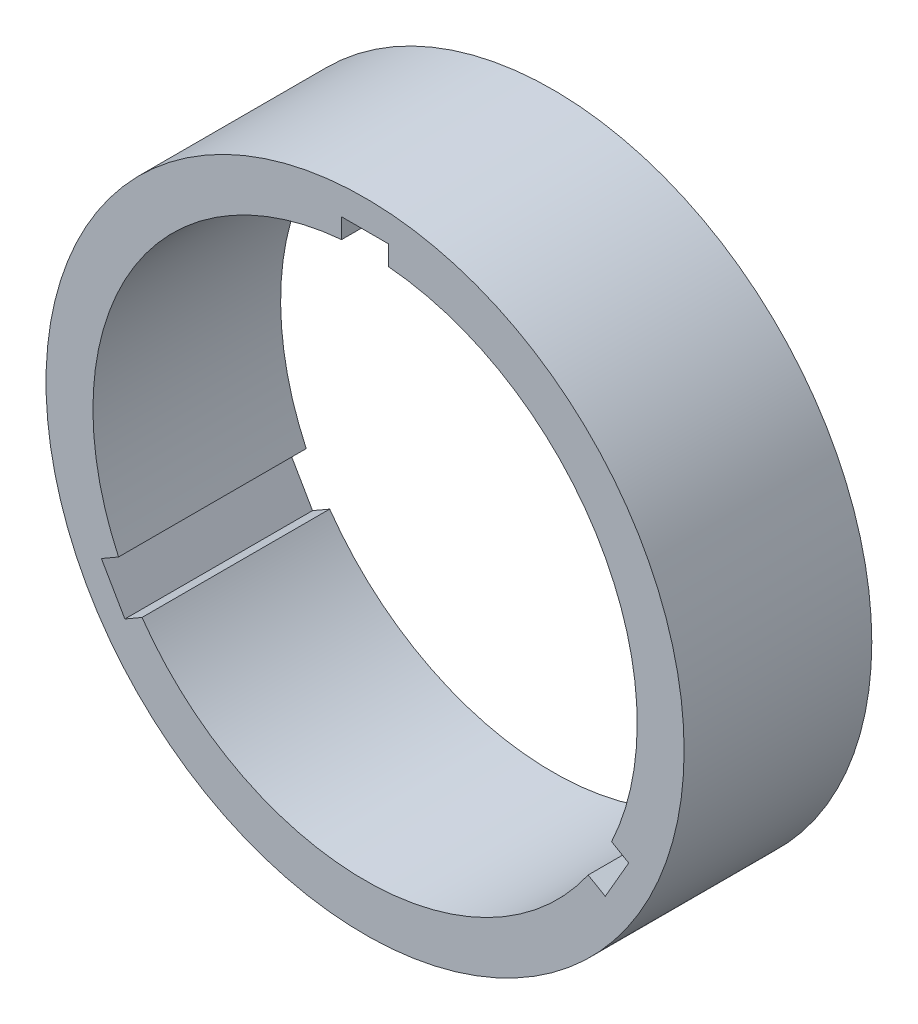
ISO-10303-21;
HEADER;
FILE_DESCRIPTION(('STEP AP214'),'2;1');
FILE_NAME('part.step','',(''),(''),'','','');
FILE_SCHEMA(('AUTOMOTIVE_DESIGN { 1 0 10303 214 1 1 1 1 }'));
ENDSEC;
DATA;
#1=APPLICATION_CONTEXT('core data for automotive mechanical design processes');
#2=APPLICATION_PROTOCOL_DEFINITION('international standard','automotive_design',2000,#1);
#3=PRODUCT_CONTEXT('',#1,'mechanical');
#4=PRODUCT('Part','Part','',(#3));
#5=PRODUCT_RELATED_PRODUCT_CATEGORY('part','',(#4));
#6=PRODUCT_DEFINITION_FORMATION('','',#4);
#7=PRODUCT_DEFINITION_CONTEXT('part definition',#1,'design');
#8=PRODUCT_DEFINITION('design','',#6,#7);
#9=PRODUCT_DEFINITION_SHAPE('','',#8);
#10=(LENGTH_UNIT() NAMED_UNIT(*) SI_UNIT(.MILLI.,.METRE.));
#11=(NAMED_UNIT(*) PLANE_ANGLE_UNIT() SI_UNIT($,.RADIAN.));
#12=(NAMED_UNIT(*) SI_UNIT($,.STERADIAN.) SOLID_ANGLE_UNIT());
#13=UNCERTAINTY_MEASURE_WITH_UNIT(LENGTH_MEASURE(1.E-05),#10,'distance_accuracy_value','');
#14=(GEOMETRIC_REPRESENTATION_CONTEXT(3) GLOBAL_UNCERTAINTY_ASSIGNED_CONTEXT((#13)) GLOBAL_UNIT_ASSIGNED_CONTEXT((#10,
#11,#12)) REPRESENTATION_CONTEXT('',''));
#15=CARTESIAN_POINT('',(0.,0.,0.));
#16=DIRECTION('',(0.,0.,1.));
#17=DIRECTION('',(1.,0.,0.));
#18=AXIS2_PLACEMENT_3D('',#15,#16,#17);
#19=CARTESIAN_POINT('',(0.,31.,20.));
#20=DIRECTION('',(0.,1.,0.));
#21=DIRECTION('',(0.,0.,1.));
#22=AXIS2_PLACEMENT_3D('',#19,#20,#21);
#23=PLANE('',#22);
#24=DIRECTION('',(1.,0.,0.));
#25=VECTOR('',#24,1.);
#26=CARTESIAN_POINT('',(0.,31.,0.));
#27=LINE('',#26,#25);
#28=CARTESIAN_POINT('',(-2.5,31.,0.));
#29=VERTEX_POINT('',#28);
#30=CARTESIAN_POINT('',(2.5,31.,0.));
#31=VERTEX_POINT('',#30);
#32=EDGE_CURVE('E243',#29,#31,#27,.T.);
#33=ORIENTED_EDGE('',*,*,#32,.T.);
#34=DIRECTION('',(0.,0.,-1.));
#35=VECTOR('',#34,1.);
#36=CARTESIAN_POINT('',(2.5,31.,20.));
#37=LINE('',#36,#35);
#38=CARTESIAN_POINT('',(2.5,31.,20.));
#39=VERTEX_POINT('',#38);
#40=EDGE_CURVE('E11',#39,#31,#37,.T.);
#41=ORIENTED_EDGE('',*,*,#40,.F.);
#42=DIRECTION('',(1.,0.,0.));
#43=VECTOR('',#42,1.);
#44=CARTESIAN_POINT('',(0.,31.,20.));
#45=LINE('',#44,#43);
#46=CARTESIAN_POINT('',(-2.5,31.,20.));
#47=VERTEX_POINT('',#46);
#48=EDGE_CURVE('E191',#47,#39,#45,.T.);
#49=ORIENTED_EDGE('',*,*,#48,.F.);
#50=DIRECTION('',(0.,0.,-1.));
#51=VECTOR('',#50,1.);
#52=CARTESIAN_POINT('',(-2.5,31.,20.));
#53=LINE('',#52,#51);
#54=EDGE_CURVE('E64',#47,#29,#53,.T.);
#55=ORIENTED_EDGE('',*,*,#54,.T.);
#56=EDGE_LOOP('',(#33,#41,#49,#55));
#57=FACE_BOUND('',#56,.T.);
#58=ADVANCED_FACE('F47',(#57),#23,.F.);
#59=CARTESIAN_POINT('',(2.50000000000001,0.,20.));
#60=DIRECTION('',(1.,0.,0.));
#61=DIRECTION('',(0.,1.,0.));
#62=AXIS2_PLACEMENT_3D('',#59,#60,#61);
#63=PLANE('',#62);
#64=DIRECTION('',(0.,-1.,0.));
#65=VECTOR('',#64,1.);
#66=CARTESIAN_POINT('',(2.50000000000001,0.,0.));
#67=LINE('',#66,#65);
#68=CARTESIAN_POINT('',(2.5,28.8920404263873,0.));
#69=VERTEX_POINT('',#68);
#70=EDGE_CURVE('E239',#31,#69,#67,.T.);
#71=ORIENTED_EDGE('',*,*,#70,.T.);
#72=DIRECTION('',(0.,0.,-1.));
#73=VECTOR('',#72,1.);
#74=CARTESIAN_POINT('',(2.5,28.8920404263873,20.));
#75=LINE('',#74,#73);
#76=CARTESIAN_POINT('',(2.5,28.8920404263873,20.));
#77=VERTEX_POINT('',#76);
#78=EDGE_CURVE('E56',#77,#69,#75,.T.);
#79=ORIENTED_EDGE('',*,*,#78,.F.);
#80=DIRECTION('',(0.,-1.,0.));
#81=VECTOR('',#80,1.);
#82=CARTESIAN_POINT('',(2.50000000000001,0.,20.));
#83=LINE('',#82,#81);
#84=EDGE_CURVE('E114',#39,#77,#83,.T.);
#85=ORIENTED_EDGE('',*,*,#84,.F.);
#86=ORIENTED_EDGE('',*,*,#40,.T.);
#87=EDGE_LOOP('',(#71,#79,#85,#86));
#88=FACE_BOUND('',#87,.T.);
#89=ADVANCED_FACE('F240',(#88),#63,.F.);
#90=CARTESIAN_POINT('',(0.,0.,20.));
#91=DIRECTION('',(0.,0.,-1.));
#92=DIRECTION('',(-1.,0.,0.));
#93=AXIS2_PLACEMENT_3D('',#90,#91,#92);
#94=CYLINDRICAL_SURFACE('',#93,29.);
#95=CARTESIAN_POINT('',(0.,0.,0.));
#96=DIRECTION('',(0.,0.,1.));
#97=DIRECTION('',(1.,0.,0.));
#98=AXIS2_PLACEMENT_3D('',#95,#96,#97);
#99=CIRCLE('',#98,29.);
#100=CARTESIAN_POINT('',(26.271240976423,-12.2809567037301,0.));
#101=VERTEX_POINT('',#100);
#102=EDGE_CURVE('E237',#101,#69,#99,.T.);
#103=ORIENTED_EDGE('',*,*,#102,.F.);
#104=DIRECTION('',(0.,0.,-1.));
#105=VECTOR('',#104,1.);
#106=CARTESIAN_POINT('',(26.271240976423,-12.2809567037301,20.));
#107=LINE('',#106,#105);
#108=CARTESIAN_POINT('',(26.271240976423,-12.2809567037301,20.));
#109=VERTEX_POINT('',#108);
#110=EDGE_CURVE('E230',#109,#101,#107,.T.);
#111=ORIENTED_EDGE('',*,*,#110,.F.);
#112=CARTESIAN_POINT('',(0.,0.,20.));
#113=DIRECTION('',(0.,0.,1.));
#114=DIRECTION('',(1.,0.,0.));
#115=AXIS2_PLACEMENT_3D('',#112,#113,#114);
#116=CIRCLE('',#115,29.);
#117=EDGE_CURVE('E172',#109,#77,#116,.T.);
#118=ORIENTED_EDGE('',*,*,#117,.T.);
#119=ORIENTED_EDGE('',*,*,#78,.T.);
#120=EDGE_LOOP('',(#103,#111,#118,#119));
#121=FACE_BOUND('',#120,.T.);
#122=ADVANCED_FACE('F235',(#121),#94,.F.);
#123=CARTESIAN_POINT('',(1.25000000000221,2.16506350946492,20.));
#124=DIRECTION('',(-0.5,-0.866025403784439,0.));
#125=DIRECTION('',(0.866025403784439,-0.5,0.));
#126=AXIS2_PLACEMENT_3D('',#123,#124,#125);
#127=PLANE('',#126);
#128=DIRECTION('',(-0.866025403784439,0.5,0.));
#129=VECTOR('',#128,1.);
#130=CARTESIAN_POINT('',(1.25000000000221,2.16506350946492,0.));
#131=LINE('',#130,#129);
#132=CARTESIAN_POINT('',(28.0967875173222,-13.3349364905365,0.));
#133=VERTEX_POINT('',#132);
#134=EDGE_CURVE('E249',#133,#101,#131,.T.);
#135=ORIENTED_EDGE('',*,*,#134,.F.);
#136=DIRECTION('',(0.,0.,-1.));
#137=VECTOR('',#136,1.);
#138=CARTESIAN_POINT('',(28.0967875173222,-13.3349364905365,20.));
#139=LINE('',#138,#137);
#140=CARTESIAN_POINT('',(28.0967875173222,-13.3349364905365,20.));
#141=VERTEX_POINT('',#140);
#142=EDGE_CURVE('E227',#141,#133,#139,.T.);
#143=ORIENTED_EDGE('',*,*,#142,.F.);
#144=DIRECTION('',(-0.866025403784439,0.5,0.));
#145=VECTOR('',#144,1.);
#146=CARTESIAN_POINT('',(1.25000000000221,2.16506350946492,20.));
#147=LINE('',#146,#145);
#148=EDGE_CURVE('E184',#141,#109,#147,.T.);
#149=ORIENTED_EDGE('',*,*,#148,.T.);
#150=ORIENTED_EDGE('',*,*,#110,.T.);
#151=EDGE_LOOP('',(#135,#143,#149,#150));
#152=FACE_BOUND('',#151,.T.);
#153=ADVANCED_FACE('F335',(#152),#127,.T.);
#154=CARTESIAN_POINT('',(26.84678751732,-15.5000000000014,20.));
#155=DIRECTION('',(0.866025403784439,-0.5,0.));
#156=DIRECTION('',(0.5,0.866025403784439,0.));
#157=AXIS2_PLACEMENT_3D('',#154,#155,#156);
#158=PLANE('',#157);
#159=DIRECTION('',(-0.5,-0.866025403784439,0.));
#160=VECTOR('',#159,1.);
#161=CARTESIAN_POINT('',(26.84678751732,-15.5000000000014,0.));
#162=LINE('',#161,#160);
#163=CARTESIAN_POINT('',(25.5967875173222,-17.6650635094587,0.));
#164=VERTEX_POINT('',#163);
#165=EDGE_CURVE('E254',#133,#164,#162,.T.);
#166=ORIENTED_EDGE('',*,*,#165,.T.);
#167=DIRECTION('',(0.,0.,-1.));
#168=VECTOR('',#167,1.);
#169=CARTESIAN_POINT('',(25.5967875173222,-17.6650635094587,20.));
#170=LINE('',#169,#168);
#171=CARTESIAN_POINT('',(25.5967875173222,-17.6650635094587,20.));
#172=VERTEX_POINT('',#171);
#173=EDGE_CURVE('E223',#172,#164,#170,.T.);
#174=ORIENTED_EDGE('',*,*,#173,.F.);
#175=DIRECTION('',(-0.5,-0.866025403784439,0.));
#176=VECTOR('',#175,1.);
#177=CARTESIAN_POINT('',(26.84678751732,-15.5000000000014,20.));
#178=LINE('',#177,#176);
#179=EDGE_CURVE('E190',#141,#172,#178,.T.);
#180=ORIENTED_EDGE('',*,*,#179,.F.);
#181=ORIENTED_EDGE('',*,*,#142,.T.);
#182=EDGE_LOOP('',(#166,#174,#180,#181));
#183=FACE_BOUND('',#182,.T.);
#184=ADVANCED_FACE('F317',(#183),#158,.F.);
#185=CARTESIAN_POINT('',(-1.2499999999978,-2.1650635094573,20.));
#186=DIRECTION('',(-0.499999999999999,-0.866025403784439,0.));
#187=DIRECTION('',(0.866025403784439,-0.499999999999999,0.));
#188=AXIS2_PLACEMENT_3D('',#185,#186,#187);
#189=PLANE('',#188);
#190=DIRECTION('',(-0.866025403784439,0.499999999999999,0.));
#191=VECTOR('',#190,1.);
#192=CARTESIAN_POINT('',(-1.2499999999978,-2.1650635094573,0.));
#193=LINE('',#192,#191);
#194=CARTESIAN_POINT('',(23.7712409764231,-16.6110837226523,0.));
#195=VERTEX_POINT('',#194);
#196=EDGE_CURVE('E260',#164,#195,#193,.T.);
#197=ORIENTED_EDGE('',*,*,#196,.T.);
#198=DIRECTION('',(0.,0.,-1.));
#199=VECTOR('',#198,1.);
#200=CARTESIAN_POINT('',(23.7712409764231,-16.6110837226523,20.));
#201=LINE('',#200,#199);
#202=CARTESIAN_POINT('',(23.7712409764231,-16.6110837226523,20.));
#203=VERTEX_POINT('',#202);
#204=EDGE_CURVE('E220',#203,#195,#201,.T.);
#205=ORIENTED_EDGE('',*,*,#204,.F.);
#206=DIRECTION('',(-0.866025403784439,0.499999999999999,0.));
#207=VECTOR('',#206,1.);
#208=CARTESIAN_POINT('',(-1.2499999999978,-2.1650635094573,20.));
#209=LINE('',#208,#207);
#210=EDGE_CURVE('E181',#172,#203,#209,.T.);
#211=ORIENTED_EDGE('',*,*,#210,.F.);
#212=ORIENTED_EDGE('',*,*,#173,.T.);
#213=EDGE_LOOP('',(#197,#205,#211,#212));
#214=FACE_BOUND('',#213,.T.);
#215=ADVANCED_FACE('F318',(#214),#189,.F.);
#216=CARTESIAN_POINT('',(-23.771240976414,-16.6110837226576,0.));
#217=VERTEX_POINT('',#216);
#218=EDGE_CURVE('E252',#217,#195,#99,.T.);
#219=ORIENTED_EDGE('',*,*,#218,.F.);
#220=DIRECTION('',(0.,0.,-1.));
#221=VECTOR('',#220,1.);
#222=CARTESIAN_POINT('',(-23.771240976414,-16.6110837226576,20.));
#223=LINE('',#222,#221);
#224=CARTESIAN_POINT('',(-23.771240976414,-16.6110837226576,20.));
#225=VERTEX_POINT('',#224);
#226=EDGE_CURVE('E217',#225,#217,#223,.T.);
#227=ORIENTED_EDGE('',*,*,#226,.F.);
#228=EDGE_CURVE('E171',#225,#203,#116,.T.);
#229=ORIENTED_EDGE('',*,*,#228,.T.);
#230=ORIENTED_EDGE('',*,*,#204,.T.);
#231=EDGE_LOOP('',(#219,#227,#229,#230));
#232=FACE_BOUND('',#231,.T.);
#233=ADVANCED_FACE('F292',(#232),#94,.F.);
#234=CARTESIAN_POINT('',(1.25000000000231,-2.1650635094651,20.));
#235=DIRECTION('',(-0.500000000000001,0.866025403784438,0.));
#236=DIRECTION('',(-0.866025403784438,-0.500000000000001,0.));
#237=AXIS2_PLACEMENT_3D('',#234,#235,#236);
#238=PLANE('',#237);
#239=DIRECTION('',(0.866025403784438,0.500000000000001,0.));
#240=VECTOR('',#239,1.);
#241=CARTESIAN_POINT('',(1.25000000000231,-2.1650635094651,0.));
#242=LINE('',#241,#240);
#243=CARTESIAN_POINT('',(-25.5967875173132,-17.6650635094639,0.));
#244=VERTEX_POINT('',#243);
#245=EDGE_CURVE('E259',#244,#217,#242,.T.);
#246=ORIENTED_EDGE('',*,*,#245,.F.);
#247=DIRECTION('',(0.,0.,-1.));
#248=VECTOR('',#247,1.);
#249=CARTESIAN_POINT('',(-25.5967875173132,-17.6650635094639,20.));
#250=LINE('',#249,#248);
#251=CARTESIAN_POINT('',(-25.5967875173132,-17.6650635094639,20.));
#252=VERTEX_POINT('',#251);
#253=EDGE_CURVE('E214',#252,#244,#250,.T.);
#254=ORIENTED_EDGE('',*,*,#253,.F.);
#255=DIRECTION('',(0.866025403784438,0.500000000000001,0.));
#256=VECTOR('',#255,1.);
#257=CARTESIAN_POINT('',(1.25000000000231,-2.1650635094651,20.));
#258=LINE('',#257,#256);
#259=EDGE_CURVE('E180',#252,#225,#258,.T.);
#260=ORIENTED_EDGE('',*,*,#259,.T.);
#261=ORIENTED_EDGE('',*,*,#226,.T.);
#262=EDGE_LOOP('',(#246,#254,#260,#261));
#263=FACE_BOUND('',#262,.T.);
#264=ADVANCED_FACE('F321',(#263),#238,.T.);
#265=CARTESIAN_POINT('',(-26.8467875173155,-15.4999999999988,20.));
#266=DIRECTION('',(-0.866025403784438,-0.5,0.));
#267=DIRECTION('',(0.5,-0.866025403784438,0.));
#268=AXIS2_PLACEMENT_3D('',#265,#266,#267);
#269=PLANE('',#268);
#270=DIRECTION('',(-0.5,0.866025403784438,0.));
#271=VECTOR('',#270,1.);
#272=CARTESIAN_POINT('',(-26.8467875173155,-15.4999999999988,0.));
#273=LINE('',#272,#271);
#274=CARTESIAN_POINT('',(-28.0967875173132,-13.3349364905417,0.));
#275=VERTEX_POINT('',#274);
#276=EDGE_CURVE('E266',#244,#275,#273,.T.);
#277=ORIENTED_EDGE('',*,*,#276,.T.);
#278=DIRECTION('',(0.,0.,-1.));
#279=VECTOR('',#278,1.);
#280=CARTESIAN_POINT('',(-28.0967875173132,-13.3349364905417,20.));
#281=LINE('',#280,#279);
#282=CARTESIAN_POINT('',(-28.0967875173132,-13.3349364905417,20.));
#283=VERTEX_POINT('',#282);
#284=EDGE_CURVE('E165',#283,#275,#281,.T.);
#285=ORIENTED_EDGE('',*,*,#284,.F.);
#286=DIRECTION('',(-0.5,0.866025403784438,0.));
#287=VECTOR('',#286,1.);
#288=CARTESIAN_POINT('',(-26.8467875173155,-15.4999999999988,20.));
#289=LINE('',#288,#287);
#290=EDGE_CURVE('E151',#252,#283,#289,.T.);
#291=ORIENTED_EDGE('',*,*,#290,.F.);
#292=ORIENTED_EDGE('',*,*,#253,.T.);
#293=EDGE_LOOP('',(#277,#285,#291,#292));
#294=FACE_BOUND('',#293,.T.);
#295=ADVANCED_FACE('F279',(#294),#269,.F.);
#296=CARTESIAN_POINT('',(-1.24999999999769,2.16506350945709,20.));
#297=DIRECTION('',(-0.500000000000001,0.866025403784438,0.));
#298=DIRECTION('',(-0.866025403784438,-0.500000000000001,0.));
#299=AXIS2_PLACEMENT_3D('',#296,#297,#298);
#300=PLANE('',#299);
#301=DIRECTION('',(0.866025403784438,0.500000000000001,0.));
#302=VECTOR('',#301,1.);
#303=CARTESIAN_POINT('',(-1.24999999999769,2.16506350945709,0.));
#304=LINE('',#303,#302);
#305=CARTESIAN_POINT('',(-26.271240976414,-12.2809567037354,0.));
#306=VERTEX_POINT('',#305);
#307=EDGE_CURVE('E161',#275,#306,#304,.T.);
#308=ORIENTED_EDGE('',*,*,#307,.T.);
#309=DIRECTION('',(0.,0.,-1.));
#310=VECTOR('',#309,1.);
#311=CARTESIAN_POINT('',(-26.271240976414,-12.2809567037354,20.));
#312=LINE('',#311,#310);
#313=CARTESIAN_POINT('',(-26.271240976414,-12.2809567037354,20.));
#314=VERTEX_POINT('',#313);
#315=EDGE_CURVE('E158',#314,#306,#312,.T.);
#316=ORIENTED_EDGE('',*,*,#315,.F.);
#317=DIRECTION('',(0.866025403784438,0.500000000000001,0.));
#318=VECTOR('',#317,1.);
#319=CARTESIAN_POINT('',(-1.24999999999769,2.16506350945709,20.));
#320=LINE('',#319,#318);
#321=EDGE_CURVE('E142',#283,#314,#320,.T.);
#322=ORIENTED_EDGE('',*,*,#321,.F.);
#323=ORIENTED_EDGE('',*,*,#284,.T.);
#324=EDGE_LOOP('',(#308,#316,#322,#323));
#325=FACE_BOUND('',#324,.T.);
#326=ADVANCED_FACE('F159',(#325),#300,.F.);
#327=CARTESIAN_POINT('',(-2.5,28.8920404263873,0.));
#328=VERTEX_POINT('',#327);
#329=EDGE_CURVE('E204',#328,#306,#99,.T.);
#330=ORIENTED_EDGE('',*,*,#329,.F.);
#331=DIRECTION('',(0.,0.,-1.));
#332=VECTOR('',#331,1.);
#333=CARTESIAN_POINT('',(-2.5,28.8920404263873,20.));
#334=LINE('',#333,#332);
#335=CARTESIAN_POINT('',(-2.5,28.8920404263873,20.));
#336=VERTEX_POINT('',#335);
#337=EDGE_CURVE('E102',#336,#328,#334,.T.);
#338=ORIENTED_EDGE('',*,*,#337,.F.);
#339=EDGE_CURVE('E148',#336,#314,#116,.T.);
#340=ORIENTED_EDGE('',*,*,#339,.T.);
#341=ORIENTED_EDGE('',*,*,#315,.T.);
#342=EDGE_LOOP('',(#330,#338,#340,#341));
#343=FACE_BOUND('',#342,.T.);
#344=ADVANCED_FACE('F167',(#343),#94,.F.);
#345=CARTESIAN_POINT('',(-2.49999999999999,0.,20.));
#346=DIRECTION('',(1.,0.,0.));
#347=DIRECTION('',(0.,1.,0.));
#348=AXIS2_PLACEMENT_3D('',#345,#346,#347);
#349=PLANE('',#348);
#350=DIRECTION('',(0.,-1.,0.));
#351=VECTOR('',#350,1.);
#352=CARTESIAN_POINT('',(-2.49999999999999,0.,0.));
#353=LINE('',#352,#351);
#354=EDGE_CURVE('E198',#29,#328,#353,.T.);
#355=ORIENTED_EDGE('',*,*,#354,.F.);
#356=ORIENTED_EDGE('',*,*,#54,.F.);
#357=DIRECTION('',(0.,-1.,0.));
#358=VECTOR('',#357,1.);
#359=CARTESIAN_POINT('',(-2.49999999999999,0.,20.));
#360=LINE('',#359,#358);
#361=EDGE_CURVE('E169',#47,#336,#360,.T.);
#362=ORIENTED_EDGE('',*,*,#361,.T.);
#363=ORIENTED_EDGE('',*,*,#337,.T.);
#364=EDGE_LOOP('',(#355,#356,#362,#363));
#365=FACE_BOUND('',#364,.T.);
#366=ADVANCED_FACE('F281',(#365),#349,.T.);
#367=CARTESIAN_POINT('',(0.,0.,20.));
#368=DIRECTION('',(0.,0.,-1.));
#369=DIRECTION('',(-1.,0.,0.));
#370=AXIS2_PLACEMENT_3D('',#367,#368,#369);
#371=CYLINDRICAL_SURFACE('',#370,34.);
#372=CARTESIAN_POINT('',(0.,0.,20.));
#373=DIRECTION('',(0.,0.,1.));
#374=DIRECTION('',(1.,0.,0.));
#375=AXIS2_PLACEMENT_3D('',#372,#373,#374);
#376=CIRCLE('',#375,34.);
#377=CARTESIAN_POINT('',(34.,0.,20.));
#378=VERTEX_POINT('',#377);
#379=EDGE_CURVE('E174',#378,#378,#376,.T.);
#380=ORIENTED_EDGE('',*,*,#379,.F.);
#381=EDGE_LOOP('',(#380));
#382=FACE_BOUND('',#381,.T.);
#383=CARTESIAN_POINT('',(0.,0.,0.));
#384=DIRECTION('',(0.,0.,1.));
#385=DIRECTION('',(1.,0.,0.));
#386=AXIS2_PLACEMENT_3D('',#383,#384,#385);
#387=CIRCLE('',#386,34.);
#388=CARTESIAN_POINT('',(34.,0.,0.));
#389=VERTEX_POINT('',#388);
#390=EDGE_CURVE('E193',#389,#389,#387,.T.);
#391=ORIENTED_EDGE('',*,*,#390,.T.);
#392=EDGE_LOOP('',(#391));
#393=FACE_BOUND('',#392,.T.);
#394=ADVANCED_FACE('F283',(#382,#393),#371,.T.);
#395=CARTESIAN_POINT('',(0.,0.,20.));
#396=DIRECTION('',(0.,0.,1.));
#397=DIRECTION('',(1.,0.,0.));
#398=AXIS2_PLACEMENT_3D('',#395,#396,#397);
#399=PLANE('',#398);
#400=ORIENTED_EDGE('',*,*,#48,.T.);
#401=ORIENTED_EDGE('',*,*,#84,.T.);
#402=ORIENTED_EDGE('',*,*,#117,.F.);
#403=ORIENTED_EDGE('',*,*,#148,.F.);
#404=ORIENTED_EDGE('',*,*,#179,.T.);
#405=ORIENTED_EDGE('',*,*,#210,.T.);
#406=ORIENTED_EDGE('',*,*,#228,.F.);
#407=ORIENTED_EDGE('',*,*,#259,.F.);
#408=ORIENTED_EDGE('',*,*,#290,.T.);
#409=ORIENTED_EDGE('',*,*,#321,.T.);
#410=ORIENTED_EDGE('',*,*,#339,.F.);
#411=ORIENTED_EDGE('',*,*,#361,.F.);
#412=EDGE_LOOP('',(#400,#401,#402,#403,#404,#405,#406,#407,#408,#409,#410,#411));
#413=FACE_BOUND('',#412,.T.);
#414=ORIENTED_EDGE('',*,*,#379,.T.);
#415=EDGE_LOOP('',(#414));
#416=FACE_BOUND('',#415,.T.);
#417=ADVANCED_FACE('F144',(#413,#416),#399,.T.);
#418=CARTESIAN_POINT('',(0.,0.,0.));
#419=DIRECTION('',(0.,0.,1.));
#420=DIRECTION('',(1.,0.,0.));
#421=AXIS2_PLACEMENT_3D('',#418,#419,#420);
#422=PLANE('',#421);
#423=ORIENTED_EDGE('',*,*,#32,.F.);
#424=ORIENTED_EDGE('',*,*,#354,.T.);
#425=ORIENTED_EDGE('',*,*,#329,.T.);
#426=ORIENTED_EDGE('',*,*,#307,.F.);
#427=ORIENTED_EDGE('',*,*,#276,.F.);
#428=ORIENTED_EDGE('',*,*,#245,.T.);
#429=ORIENTED_EDGE('',*,*,#218,.T.);
#430=ORIENTED_EDGE('',*,*,#196,.F.);
#431=ORIENTED_EDGE('',*,*,#165,.F.);
#432=ORIENTED_EDGE('',*,*,#134,.T.);
#433=ORIENTED_EDGE('',*,*,#102,.T.);
#434=ORIENTED_EDGE('',*,*,#70,.F.);
#435=EDGE_LOOP('',(#423,#424,#425,#426,#427,#428,#429,#430,#431,#432,#433,#434));
#436=FACE_BOUND('',#435,.T.);
#437=ORIENTED_EDGE('',*,*,#390,.F.);
#438=EDGE_LOOP('',(#437));
#439=FACE_BOUND('',#438,.T.);
#440=ADVANCED_FACE('F245',(#436,#439),#422,.F.);
#441=CLOSED_SHELL('',(#58,#89,#122,#153,#184,#215,#233,#264,#295,#326,#344,#366,#394,#417,#440));
#442=MANIFOLD_SOLID_BREP('B2',#441);
#443=ADVANCED_BREP_SHAPE_REPRESENTATION('',(#18,#442),#14);
#444=SHAPE_DEFINITION_REPRESENTATION(#9,#443);
ENDSEC;
END-ISO-10303-21;
